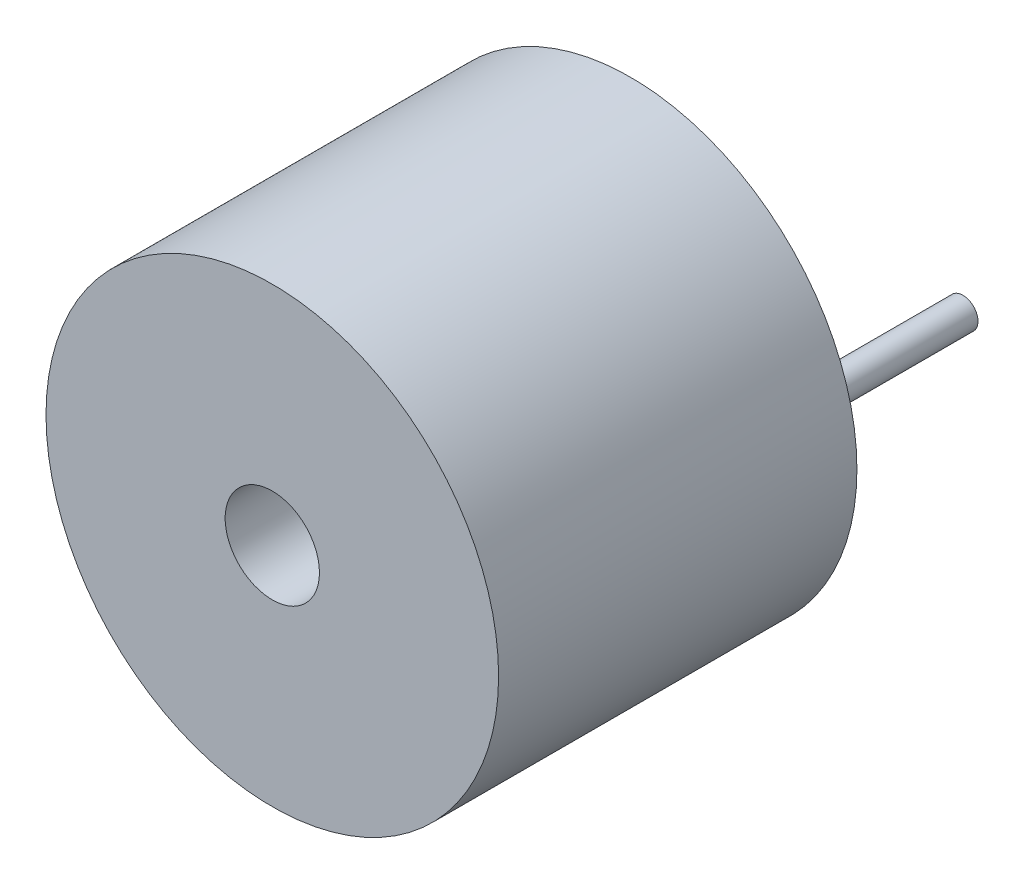
ISO-10303-21;
HEADER;
FILE_DESCRIPTION(('STEP AP214'),'2;1');
FILE_NAME('part.step','',(''),(''),'','','');
FILE_SCHEMA(('AUTOMOTIVE_DESIGN { 1 0 10303 214 1 1 1 1 }'));
ENDSEC;
DATA;
#1=APPLICATION_CONTEXT('core data for automotive mechanical design processes');
#2=APPLICATION_PROTOCOL_DEFINITION('international standard','automotive_design',2000,#1);
#3=PRODUCT_CONTEXT('',#1,'mechanical');
#4=PRODUCT('Part','Part','',(#3));
#5=PRODUCT_RELATED_PRODUCT_CATEGORY('part','',(#4));
#6=PRODUCT_DEFINITION_FORMATION('','',#4);
#7=PRODUCT_DEFINITION_CONTEXT('part definition',#1,'design');
#8=PRODUCT_DEFINITION('design','',#6,#7);
#9=PRODUCT_DEFINITION_SHAPE('','',#8);
#10=(LENGTH_UNIT() NAMED_UNIT(*) SI_UNIT(.MILLI.,.METRE.));
#11=(NAMED_UNIT(*) PLANE_ANGLE_UNIT() SI_UNIT($,.RADIAN.));
#12=(NAMED_UNIT(*) SI_UNIT($,.STERADIAN.) SOLID_ANGLE_UNIT());
#13=UNCERTAINTY_MEASURE_WITH_UNIT(LENGTH_MEASURE(1.E-05),#10,'distance_accuracy_value','');
#14=(GEOMETRIC_REPRESENTATION_CONTEXT(3) GLOBAL_UNCERTAINTY_ASSIGNED_CONTEXT((#13)) GLOBAL_UNIT_ASSIGNED_CONTEXT((#10,
#11,#12)) REPRESENTATION_CONTEXT('',''));
#15=CARTESIAN_POINT('',(0.,0.,0.));
#16=DIRECTION('',(0.,0.,1.));
#17=DIRECTION('',(1.,0.,0.));
#18=AXIS2_PLACEMENT_3D('',#15,#16,#17);
#19=CARTESIAN_POINT('',(0.,0.,0.));
#20=DIRECTION('',(0.,0.,1.));
#21=DIRECTION('',(1.,0.,0.));
#22=AXIS2_PLACEMENT_3D('',#19,#20,#21);
#23=PLANE('',#22);
#24=CARTESIAN_POINT('',(3.81,0.,0.));
#25=DIRECTION('',(0.,0.,1.));
#26=DIRECTION('',(1.,0.,0.));
#27=AXIS2_PLACEMENT_3D('',#24,#25,#26);
#28=CIRCLE('',#27,0.4);
#29=CARTESIAN_POINT('',(4.21,0.,0.));
#30=VERTEX_POINT('',#29);
#31=EDGE_CURVE('E37',#30,#30,#28,.F.);
#32=ORIENTED_EDGE('',*,*,#31,.F.);
#33=EDGE_LOOP('',(#32));
#34=FACE_BOUND('',#33,.T.);
#35=CARTESIAN_POINT('',(0.,0.,0.));
#36=DIRECTION('',(0.,0.,1.));
#37=DIRECTION('',(1.,0.,0.));
#38=AXIS2_PLACEMENT_3D('',#35,#36,#37);
#39=CIRCLE('',#38,6.);
#40=CARTESIAN_POINT('',(6.,0.,0.));
#41=VERTEX_POINT('',#40);
#42=EDGE_CURVE('E45',#41,#41,#39,.T.);
#43=ORIENTED_EDGE('',*,*,#42,.F.);
#44=EDGE_LOOP('',(#43));
#45=FACE_BOUND('',#44,.T.);
#46=CARTESIAN_POINT('',(-3.81,0.,0.));
#47=DIRECTION('',(0.,0.,1.));
#48=DIRECTION('',(1.,0.,0.));
#49=AXIS2_PLACEMENT_3D('',#46,#47,#48);
#50=CIRCLE('',#49,0.4);
#51=CARTESIAN_POINT('',(-3.41,0.,0.));
#52=VERTEX_POINT('',#51);
#53=EDGE_CURVE('E10',#52,#52,#50,.F.);
#54=ORIENTED_EDGE('',*,*,#53,.F.);
#55=EDGE_LOOP('',(#54));
#56=FACE_BOUND('',#55,.T.);
#57=ADVANCED_FACE('F30',(#34,#45,#56),#23,.F.);
#58=CARTESIAN_POINT('',(0.,0.,9.5));
#59=DIRECTION('',(0.,0.,-1.));
#60=DIRECTION('',(-1.,0.,0.));
#61=AXIS2_PLACEMENT_3D('',#58,#59,#60);
#62=CYLINDRICAL_SURFACE('',#61,6.);
#63=CARTESIAN_POINT('',(0.,0.,9.5));
#64=DIRECTION('',(0.,0.,1.));
#65=DIRECTION('',(1.,0.,0.));
#66=AXIS2_PLACEMENT_3D('',#63,#64,#65);
#67=CIRCLE('',#66,6.);
#68=CARTESIAN_POINT('',(6.,0.,9.5));
#69=VERTEX_POINT('',#68);
#70=EDGE_CURVE('E41',#69,#69,#67,.T.);
#71=ORIENTED_EDGE('',*,*,#70,.F.);
#72=EDGE_LOOP('',(#71));
#73=FACE_BOUND('',#72,.T.);
#74=ORIENTED_EDGE('',*,*,#42,.T.);
#75=EDGE_LOOP('',(#74));
#76=FACE_BOUND('',#75,.T.);
#77=ADVANCED_FACE('F32',(#73,#76),#62,.T.);
#78=CARTESIAN_POINT('',(0.,0.,9.5));
#79=DIRECTION('',(0.,0.,1.));
#80=DIRECTION('',(1.,0.,0.));
#81=AXIS2_PLACEMENT_3D('',#78,#79,#80);
#82=PLANE('',#81);
#83=CARTESIAN_POINT('',(0.,0.,9.5));
#84=DIRECTION('',(0.,0.,1.));
#85=DIRECTION('',(1.,0.,0.));
#86=AXIS2_PLACEMENT_3D('',#83,#84,#85);
#87=CIRCLE('',#86,1.25);
#88=CARTESIAN_POINT('',(1.25,0.,9.5));
#89=VERTEX_POINT('',#88);
#90=EDGE_CURVE('E59',#89,#89,#87,.T.);
#91=ORIENTED_EDGE('',*,*,#90,.F.);
#92=EDGE_LOOP('',(#91));
#93=FACE_BOUND('',#92,.T.);
#94=ORIENTED_EDGE('',*,*,#70,.T.);
#95=EDGE_LOOP('',(#94));
#96=FACE_BOUND('',#95,.T.);
#97=ADVANCED_FACE('F65',(#93,#96),#82,.T.);
#98=CARTESIAN_POINT('',(3.81,0.,-5.));
#99=DIRECTION('',(0.,0.,1.));
#100=DIRECTION('',(1.,0.,0.));
#101=AXIS2_PLACEMENT_3D('',#98,#99,#100);
#102=CYLINDRICAL_SURFACE('',#101,0.4);
#103=CARTESIAN_POINT('',(3.81,0.,-5.));
#104=DIRECTION('',(0.,0.,-1.));
#105=DIRECTION('',(-1.,0.,0.));
#106=AXIS2_PLACEMENT_3D('',#103,#104,#105);
#107=CIRCLE('',#106,0.4);
#108=CARTESIAN_POINT('',(3.41,0.,-5.));
#109=VERTEX_POINT('',#108);
#110=EDGE_CURVE('E50',#109,#109,#107,.T.);
#111=ORIENTED_EDGE('',*,*,#110,.F.);
#112=EDGE_LOOP('',(#111));
#113=FACE_BOUND('',#112,.T.);
#114=ORIENTED_EDGE('',*,*,#31,.T.);
#115=EDGE_LOOP('',(#114));
#116=FACE_BOUND('',#115,.T.);
#117=ADVANCED_FACE('F68',(#113,#116),#102,.T.);
#118=CARTESIAN_POINT('',(3.81,0.,-5.));
#119=DIRECTION('',(0.,0.,-1.));
#120=DIRECTION('',(-1.,0.,0.));
#121=AXIS2_PLACEMENT_3D('',#118,#119,#120);
#122=PLANE('',#121);
#123=ORIENTED_EDGE('',*,*,#110,.T.);
#124=EDGE_LOOP('',(#123));
#125=FACE_BOUND('',#124,.T.);
#126=ADVANCED_FACE('F84',(#125),#122,.T.);
#127=CARTESIAN_POINT('',(-3.81,0.,-5.));
#128=DIRECTION('',(0.,0.,1.));
#129=DIRECTION('',(1.,0.,0.));
#130=AXIS2_PLACEMENT_3D('',#127,#128,#129);
#131=CYLINDRICAL_SURFACE('',#130,0.4);
#132=CARTESIAN_POINT('',(-3.81,0.,-5.));
#133=DIRECTION('',(0.,0.,-1.));
#134=DIRECTION('',(1.,0.,0.));
#135=AXIS2_PLACEMENT_3D('',#132,#133,#134);
#136=CIRCLE('',#135,0.4);
#137=CARTESIAN_POINT('',(-3.41,0.,-5.));
#138=VERTEX_POINT('',#137);
#139=EDGE_CURVE('E53',#138,#138,#136,.T.);
#140=ORIENTED_EDGE('',*,*,#139,.F.);
#141=EDGE_LOOP('',(#140));
#142=FACE_BOUND('',#141,.T.);
#143=ORIENTED_EDGE('',*,*,#53,.T.);
#144=EDGE_LOOP('',(#143));
#145=FACE_BOUND('',#144,.T.);
#146=ADVANCED_FACE('F88',(#142,#145),#131,.T.);
#147=CARTESIAN_POINT('',(-3.81,0.,-5.));
#148=DIRECTION('',(0.,0.,1.));
#149=DIRECTION('',(1.,0.,0.));
#150=AXIS2_PLACEMENT_3D('',#147,#148,#149);
#151=PLANE('',#150);
#152=ORIENTED_EDGE('',*,*,#139,.T.);
#153=EDGE_LOOP('',(#152));
#154=FACE_BOUND('',#153,.T.);
#155=ADVANCED_FACE('F92',(#154),#151,.F.);
#156=CARTESIAN_POINT('',(0.,0.,4.5));
#157=DIRECTION('',(0.,0.,1.));
#158=DIRECTION('',(1.,0.,0.));
#159=AXIS2_PLACEMENT_3D('',#156,#157,#158);
#160=CYLINDRICAL_SURFACE('',#159,1.25);
#161=CARTESIAN_POINT('',(0.,0.,4.5));
#162=DIRECTION('',(0.,0.,1.));
#163=DIRECTION('',(1.,0.,0.));
#164=AXIS2_PLACEMENT_3D('',#161,#162,#163);
#165=CIRCLE('',#164,1.25);
#166=CARTESIAN_POINT('',(1.25,0.,4.5));
#167=VERTEX_POINT('',#166);
#168=EDGE_CURVE('E56',#167,#167,#165,.T.);
#169=ORIENTED_EDGE('',*,*,#168,.F.);
#170=EDGE_LOOP('',(#169));
#171=FACE_BOUND('',#170,.T.);
#172=ORIENTED_EDGE('',*,*,#90,.T.);
#173=EDGE_LOOP('',(#172));
#174=FACE_BOUND('',#173,.T.);
#175=ADVANCED_FACE('F63',(#171,#174),#160,.F.);
#176=CARTESIAN_POINT('',(0.,0.,4.5));
#177=DIRECTION('',(0.,0.,1.));
#178=DIRECTION('',(1.,0.,0.));
#179=AXIS2_PLACEMENT_3D('',#176,#177,#178);
#180=PLANE('',#179);
#181=ORIENTED_EDGE('',*,*,#168,.T.);
#182=EDGE_LOOP('',(#181));
#183=FACE_BOUND('',#182,.T.);
#184=ADVANCED_FACE('F99',(#183),#180,.T.);
#185=CLOSED_SHELL('',(#57,#77,#97,#117,#126,#146,#155,#175,#184));
#186=MANIFOLD_SOLID_BREP('B2',#185);
#187=ADVANCED_BREP_SHAPE_REPRESENTATION('',(#18,#186),#14);
#188=SHAPE_DEFINITION_REPRESENTATION(#9,#187);
ENDSEC;
END-ISO-10303-21;
